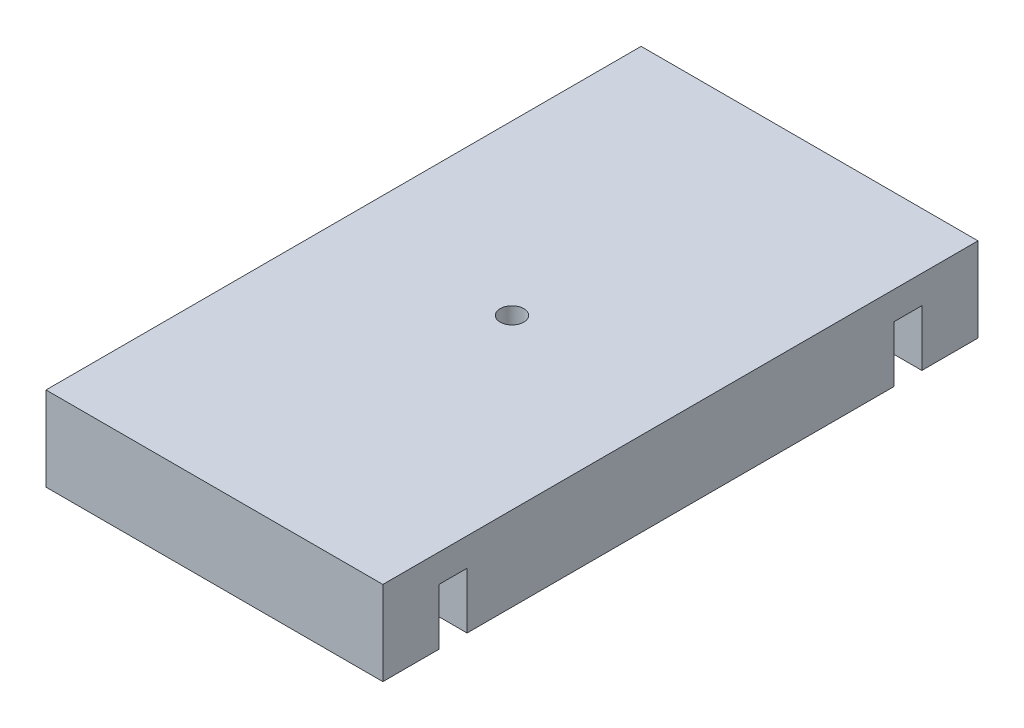
ISO-10303-21;
HEADER;
FILE_DESCRIPTION(('STEP AP214'),'2;1');
FILE_NAME('part.step','',(''),(''),'','','');
FILE_SCHEMA(('AUTOMOTIVE_DESIGN { 1 0 10303 214 1 1 1 1 }'));
ENDSEC;
DATA;
#1=APPLICATION_CONTEXT('core data for automotive mechanical design processes');
#2=APPLICATION_PROTOCOL_DEFINITION('international standard','automotive_design',2000,#1);
#3=PRODUCT_CONTEXT('',#1,'mechanical');
#4=PRODUCT('Part','Part','',(#3));
#5=PRODUCT_RELATED_PRODUCT_CATEGORY('part','',(#4));
#6=PRODUCT_DEFINITION_FORMATION('','',#4);
#7=PRODUCT_DEFINITION_CONTEXT('part definition',#1,'design');
#8=PRODUCT_DEFINITION('design','',#6,#7);
#9=PRODUCT_DEFINITION_SHAPE('','',#8);
#10=(LENGTH_UNIT() NAMED_UNIT(*) SI_UNIT(.MILLI.,.METRE.));
#11=(NAMED_UNIT(*) PLANE_ANGLE_UNIT() SI_UNIT($,.RADIAN.));
#12=(NAMED_UNIT(*) SI_UNIT($,.STERADIAN.) SOLID_ANGLE_UNIT());
#13=UNCERTAINTY_MEASURE_WITH_UNIT(LENGTH_MEASURE(1.E-05),#10,'distance_accuracy_value','');
#14=(GEOMETRIC_REPRESENTATION_CONTEXT(3) GLOBAL_UNCERTAINTY_ASSIGNED_CONTEXT((#13)) GLOBAL_UNIT_ASSIGNED_CONTEXT((#10,
#11,#12)) REPRESENTATION_CONTEXT('',''));
#15=CARTESIAN_POINT('',(0.,0.,0.));
#16=DIRECTION('',(0.,0.,1.));
#17=DIRECTION('',(1.,0.,0.));
#18=AXIS2_PLACEMENT_3D('',#15,#16,#17);
#19=CARTESIAN_POINT('',(0.,0.,0.));
#20=DIRECTION('',(0.,1.,0.));
#21=DIRECTION('',(0.,0.,1.));
#22=AXIS2_PLACEMENT_3D('',#19,#20,#21);
#23=PLANE('',#22);
#24=DIRECTION('',(0.,0.,1.));
#25=VECTOR('',#24,1.);
#26=CARTESIAN_POINT('',(-30.,0.,-53.));
#27=LINE('',#26,#25);
#28=CARTESIAN_POINT('',(-30.,0.,43.));
#29=VERTEX_POINT('',#28);
#30=CARTESIAN_POINT('',(-30.,0.,53.));
#31=VERTEX_POINT('',#30);
#32=EDGE_CURVE('E149',#29,#31,#27,.T.);
#33=ORIENTED_EDGE('',*,*,#32,.F.);
#34=DIRECTION('',(1.,0.,0.));
#35=VECTOR('',#34,1.);
#36=CARTESIAN_POINT('',(0.,0.,43.));
#37=LINE('',#36,#35);
#38=CARTESIAN_POINT('',(30.,0.,43.));
#39=VERTEX_POINT('',#38);
#40=EDGE_CURVE('E174',#29,#39,#37,.T.);
#41=ORIENTED_EDGE('',*,*,#40,.T.);
#42=DIRECTION('',(0.,0.,-1.));
#43=VECTOR('',#42,1.);
#44=CARTESIAN_POINT('',(30.,0.,-53.));
#45=LINE('',#44,#43);
#46=CARTESIAN_POINT('',(30.,0.,53.));
#47=VERTEX_POINT('',#46);
#48=EDGE_CURVE('E217',#47,#39,#45,.T.);
#49=ORIENTED_EDGE('',*,*,#48,.F.);
#50=DIRECTION('',(1.,0.,0.));
#51=VECTOR('',#50,1.);
#52=CARTESIAN_POINT('',(-30.,0.,53.));
#53=LINE('',#52,#51);
#54=EDGE_CURVE('E152',#31,#47,#53,.T.);
#55=ORIENTED_EDGE('',*,*,#54,.F.);
#56=EDGE_LOOP('',(#33,#41,#49,#55));
#57=FACE_BOUND('',#56,.T.);
#58=ADVANCED_FACE('F38',(#57),#23,.F.);
#59=CARTESIAN_POINT('',(30.,0.,-43.));
#60=VERTEX_POINT('',#59);
#61=CARTESIAN_POINT('',(30.,0.,-53.));
#62=VERTEX_POINT('',#61);
#63=EDGE_CURVE('E210',#60,#62,#45,.T.);
#64=ORIENTED_EDGE('',*,*,#63,.F.);
#65=DIRECTION('',(-1.,0.,0.));
#66=VECTOR('',#65,1.);
#67=CARTESIAN_POINT('',(0.,0.,-43.));
#68=LINE('',#67,#66);
#69=CARTESIAN_POINT('',(-30.,0.,-43.));
#70=VERTEX_POINT('',#69);
#71=EDGE_CURVE('E135',#60,#70,#68,.T.);
#72=ORIENTED_EDGE('',*,*,#71,.T.);
#73=CARTESIAN_POINT('',(-30.,0.,-53.));
#74=VERTEX_POINT('',#73);
#75=EDGE_CURVE('E148',#74,#70,#27,.T.);
#76=ORIENTED_EDGE('',*,*,#75,.F.);
#77=DIRECTION('',(-1.,0.,0.));
#78=VECTOR('',#77,1.);
#79=CARTESIAN_POINT('',(-30.,0.,-53.));
#80=LINE('',#79,#78);
#81=EDGE_CURVE('E153',#62,#74,#80,.T.);
#82=ORIENTED_EDGE('',*,*,#81,.F.);
#83=EDGE_LOOP('',(#64,#72,#76,#82));
#84=FACE_BOUND('',#83,.T.);
#85=ADVANCED_FACE('F227',(#84),#23,.F.);
#86=CARTESIAN_POINT('',(30.,15.,-53.));
#87=DIRECTION('',(-1.,0.,0.));
#88=DIRECTION('',(0.,0.,1.));
#89=AXIS2_PLACEMENT_3D('',#86,#87,#88);
#90=PLANE('',#89);
#91=ORIENTED_EDGE('',*,*,#48,.T.);
#92=DIRECTION('',(0.,1.,0.));
#93=VECTOR('',#92,1.);
#94=CARTESIAN_POINT('',(30.,15.,43.));
#95=LINE('',#94,#93);
#96=CARTESIAN_POINT('',(30.,10.,43.));
#97=VERTEX_POINT('',#96);
#98=EDGE_CURVE('E202',#39,#97,#95,.T.);
#99=ORIENTED_EDGE('',*,*,#98,.T.);
#100=DIRECTION('',(0.,0.,-1.));
#101=VECTOR('',#100,1.);
#102=CARTESIAN_POINT('',(30.,10.,-53.));
#103=LINE('',#102,#101);
#104=CARTESIAN_POINT('',(30.,10.,38.));
#105=VERTEX_POINT('',#104);
#106=EDGE_CURVE('E207',#97,#105,#103,.T.);
#107=ORIENTED_EDGE('',*,*,#106,.T.);
#108=DIRECTION('',(0.,-1.,0.));
#109=VECTOR('',#108,1.);
#110=CARTESIAN_POINT('',(30.,15.,38.));
#111=LINE('',#110,#109);
#112=CARTESIAN_POINT('',(30.,0.,38.));
#113=VERTEX_POINT('',#112);
#114=EDGE_CURVE('E196',#105,#113,#111,.T.);
#115=ORIENTED_EDGE('',*,*,#114,.T.);
#116=CARTESIAN_POINT('',(30.,0.,-38.));
#117=VERTEX_POINT('',#116);
#118=EDGE_CURVE('E219',#113,#117,#45,.T.);
#119=ORIENTED_EDGE('',*,*,#118,.T.);
#120=DIRECTION('',(0.,1.,0.));
#121=VECTOR('',#120,1.);
#122=CARTESIAN_POINT('',(30.,15.,-38.));
#123=LINE('',#122,#121);
#124=CARTESIAN_POINT('',(30.,10.,-38.));
#125=VERTEX_POINT('',#124);
#126=EDGE_CURVE('E61',#117,#125,#123,.T.);
#127=ORIENTED_EDGE('',*,*,#126,.T.);
#128=DIRECTION('',(0.,0.,1.));
#129=VECTOR('',#128,1.);
#130=CARTESIAN_POINT('',(30.,10.,-53.));
#131=LINE('',#130,#129);
#132=CARTESIAN_POINT('',(30.,10.,-43.));
#133=VERTEX_POINT('',#132);
#134=EDGE_CURVE('E205',#133,#125,#131,.T.);
#135=ORIENTED_EDGE('',*,*,#134,.F.);
#136=DIRECTION('',(0.,-1.,0.));
#137=VECTOR('',#136,1.);
#138=CARTESIAN_POINT('',(30.,15.,-43.));
#139=LINE('',#138,#137);
#140=EDGE_CURVE('E187',#133,#60,#139,.T.);
#141=ORIENTED_EDGE('',*,*,#140,.T.);
#142=ORIENTED_EDGE('',*,*,#63,.T.);
#143=DIRECTION('',(0.,-1.,0.));
#144=VECTOR('',#143,1.);
#145=CARTESIAN_POINT('',(30.,15.,-53.));
#146=LINE('',#145,#144);
#147=CARTESIAN_POINT('',(30.,15.,-53.));
#148=VERTEX_POINT('',#147);
#149=EDGE_CURVE('E136',#148,#62,#146,.T.);
#150=ORIENTED_EDGE('',*,*,#149,.F.);
#151=DIRECTION('',(0.,0.,-1.));
#152=VECTOR('',#151,1.);
#153=CARTESIAN_POINT('',(30.,15.,-53.));
#154=LINE('',#153,#152);
#155=CARTESIAN_POINT('',(30.,15.,53.));
#156=VERTEX_POINT('',#155);
#157=EDGE_CURVE('E158',#156,#148,#154,.T.);
#158=ORIENTED_EDGE('',*,*,#157,.F.);
#159=DIRECTION('',(0.,-1.,0.));
#160=VECTOR('',#159,1.);
#161=CARTESIAN_POINT('',(30.,15.,53.));
#162=LINE('',#161,#160);
#163=EDGE_CURVE('E159',#156,#47,#162,.T.);
#164=ORIENTED_EDGE('',*,*,#163,.T.);
#165=EDGE_LOOP('',(#91,#99,#107,#115,#119,#127,#135,#141,#142,#150,#158,#164));
#166=FACE_BOUND('',#165,.T.);
#167=ADVANCED_FACE('F40',(#166),#90,.F.);
#168=CARTESIAN_POINT('',(-30.,15.,-53.));
#169=DIRECTION('',(0.,0.,1.));
#170=DIRECTION('',(1.,0.,0.));
#171=AXIS2_PLACEMENT_3D('',#168,#169,#170);
#172=PLANE('',#171);
#173=ORIENTED_EDGE('',*,*,#81,.T.);
#174=DIRECTION('',(0.,-1.,0.));
#175=VECTOR('',#174,1.);
#176=CARTESIAN_POINT('',(-30.,15.,-53.));
#177=LINE('',#176,#175);
#178=CARTESIAN_POINT('',(-30.,15.,-53.));
#179=VERTEX_POINT('',#178);
#180=EDGE_CURVE('E166',#179,#74,#177,.T.);
#181=ORIENTED_EDGE('',*,*,#180,.F.);
#182=DIRECTION('',(-1.,0.,0.));
#183=VECTOR('',#182,1.);
#184=CARTESIAN_POINT('',(-30.,15.,-53.));
#185=LINE('',#184,#183);
#186=EDGE_CURVE('E213',#148,#179,#185,.T.);
#187=ORIENTED_EDGE('',*,*,#186,.F.);
#188=ORIENTED_EDGE('',*,*,#149,.T.);
#189=EDGE_LOOP('',(#173,#181,#187,#188));
#190=FACE_BOUND('',#189,.T.);
#191=ADVANCED_FACE('F230',(#190),#172,.F.);
#192=CARTESIAN_POINT('',(-30.,15.,-53.));
#193=DIRECTION('',(1.,0.,0.));
#194=DIRECTION('',(0.,0.,-1.));
#195=AXIS2_PLACEMENT_3D('',#192,#193,#194);
#196=PLANE('',#195);
#197=DIRECTION('',(0.,0.,1.));
#198=VECTOR('',#197,1.);
#199=CARTESIAN_POINT('',(-30.,10.,-53.));
#200=LINE('',#199,#198);
#201=CARTESIAN_POINT('',(-30.,10.,38.));
#202=VERTEX_POINT('',#201);
#203=CARTESIAN_POINT('',(-30.,10.,43.));
#204=VERTEX_POINT('',#203);
#205=EDGE_CURVE('E11',#202,#204,#200,.T.);
#206=ORIENTED_EDGE('',*,*,#205,.T.);
#207=DIRECTION('',(0.,-1.,0.));
#208=VECTOR('',#207,1.);
#209=CARTESIAN_POINT('',(-30.,15.,43.));
#210=LINE('',#209,#208);
#211=EDGE_CURVE('E199',#204,#29,#210,.T.);
#212=ORIENTED_EDGE('',*,*,#211,.T.);
#213=ORIENTED_EDGE('',*,*,#32,.T.);
#214=DIRECTION('',(0.,-1.,0.));
#215=VECTOR('',#214,1.);
#216=CARTESIAN_POINT('',(-30.,15.,53.));
#217=LINE('',#216,#215);
#218=CARTESIAN_POINT('',(-30.,15.,53.));
#219=VERTEX_POINT('',#218);
#220=EDGE_CURVE('E162',#219,#31,#217,.T.);
#221=ORIENTED_EDGE('',*,*,#220,.F.);
#222=DIRECTION('',(0.,0.,1.));
#223=VECTOR('',#222,1.);
#224=CARTESIAN_POINT('',(-30.,15.,-53.));
#225=LINE('',#224,#223);
#226=EDGE_CURVE('E215',#179,#219,#225,.T.);
#227=ORIENTED_EDGE('',*,*,#226,.F.);
#228=ORIENTED_EDGE('',*,*,#180,.T.);
#229=ORIENTED_EDGE('',*,*,#75,.T.);
#230=DIRECTION('',(0.,1.,0.));
#231=VECTOR('',#230,1.);
#232=CARTESIAN_POINT('',(-30.,15.,-43.));
#233=LINE('',#232,#231);
#234=CARTESIAN_POINT('',(-30.,10.,-43.));
#235=VERTEX_POINT('',#234);
#236=EDGE_CURVE('E185',#70,#235,#233,.T.);
#237=ORIENTED_EDGE('',*,*,#236,.T.);
#238=DIRECTION('',(0.,0.,-1.));
#239=VECTOR('',#238,1.);
#240=CARTESIAN_POINT('',(-30.,10.,-53.));
#241=LINE('',#240,#239);
#242=CARTESIAN_POINT('',(-30.,10.,-38.));
#243=VERTEX_POINT('',#242);
#244=EDGE_CURVE('E46',#243,#235,#241,.T.);
#245=ORIENTED_EDGE('',*,*,#244,.F.);
#246=DIRECTION('',(0.,-1.,0.));
#247=VECTOR('',#246,1.);
#248=CARTESIAN_POINT('',(-30.,15.,-38.));
#249=LINE('',#248,#247);
#250=CARTESIAN_POINT('',(-30.,0.,-38.));
#251=VERTEX_POINT('',#250);
#252=EDGE_CURVE('E129',#243,#251,#249,.T.);
#253=ORIENTED_EDGE('',*,*,#252,.T.);
#254=CARTESIAN_POINT('',(-30.,0.,38.));
#255=VERTEX_POINT('',#254);
#256=EDGE_CURVE('E142',#251,#255,#27,.T.);
#257=ORIENTED_EDGE('',*,*,#256,.T.);
#258=DIRECTION('',(0.,1.,0.));
#259=VECTOR('',#258,1.);
#260=CARTESIAN_POINT('',(-30.,15.,38.));
#261=LINE('',#260,#259);
#262=EDGE_CURVE('E53',#255,#202,#261,.T.);
#263=ORIENTED_EDGE('',*,*,#262,.T.);
#264=EDGE_LOOP('',(#206,#212,#213,#221,#227,#228,#229,#237,#245,#253,#257,#263));
#265=FACE_BOUND('',#264,.T.);
#266=ADVANCED_FACE('F141',(#265),#196,.F.);
#267=CARTESIAN_POINT('',(-30.,15.,53.));
#268=DIRECTION('',(0.,0.,-1.));
#269=DIRECTION('',(-1.,0.,0.));
#270=AXIS2_PLACEMENT_3D('',#267,#268,#269);
#271=PLANE('',#270);
#272=ORIENTED_EDGE('',*,*,#54,.T.);
#273=ORIENTED_EDGE('',*,*,#163,.F.);
#274=DIRECTION('',(1.,0.,0.));
#275=VECTOR('',#274,1.);
#276=CARTESIAN_POINT('',(-30.,15.,53.));
#277=LINE('',#276,#275);
#278=EDGE_CURVE('E163',#219,#156,#277,.T.);
#279=ORIENTED_EDGE('',*,*,#278,.F.);
#280=ORIENTED_EDGE('',*,*,#220,.T.);
#281=EDGE_LOOP('',(#272,#273,#279,#280));
#282=FACE_BOUND('',#281,.T.);
#283=ADVANCED_FACE('F283',(#282),#271,.F.);
#284=CARTESIAN_POINT('',(0.,15.,0.));
#285=DIRECTION('',(0.,1.,0.));
#286=DIRECTION('',(0.,0.,1.));
#287=AXIS2_PLACEMENT_3D('',#284,#285,#286);
#288=PLANE('',#287);
#289=CARTESIAN_POINT('',(0.,15.,0.));
#290=DIRECTION('',(0.,1.,0.));
#291=DIRECTION('',(0.,0.,1.));
#292=AXIS2_PLACEMENT_3D('',#289,#290,#291);
#293=CIRCLE('',#292,2.1);
#294=CARTESIAN_POINT('',(0.,15.,2.1));
#295=VERTEX_POINT('',#294);
#296=EDGE_CURVE('E188',#295,#295,#293,.T.);
#297=ORIENTED_EDGE('',*,*,#296,.F.);
#298=EDGE_LOOP('',(#297));
#299=FACE_BOUND('',#298,.T.);
#300=ORIENTED_EDGE('',*,*,#157,.T.);
#301=ORIENTED_EDGE('',*,*,#186,.T.);
#302=ORIENTED_EDGE('',*,*,#226,.T.);
#303=ORIENTED_EDGE('',*,*,#278,.T.);
#304=EDGE_LOOP('',(#300,#301,#302,#303));
#305=FACE_BOUND('',#304,.T.);
#306=ADVANCED_FACE('F233',(#299,#305),#288,.T.);
#307=CARTESIAN_POINT('',(0.,0.,0.));
#308=DIRECTION('',(0.,1.,0.));
#309=DIRECTION('',(0.,0.,1.));
#310=AXIS2_PLACEMENT_3D('',#307,#308,#309);
#311=CIRCLE('',#310,2.1);
#312=CARTESIAN_POINT('',(0.,0.,2.1));
#313=VERTEX_POINT('',#312);
#314=EDGE_CURVE('E256',#313,#313,#311,.T.);
#315=ORIENTED_EDGE('',*,*,#314,.T.);
#316=EDGE_LOOP('',(#315));
#317=FACE_BOUND('',#316,.T.);
#318=ORIENTED_EDGE('',*,*,#118,.F.);
#319=DIRECTION('',(-1.,0.,0.));
#320=VECTOR('',#319,1.);
#321=CARTESIAN_POINT('',(0.,0.,38.));
#322=LINE('',#321,#320);
#323=EDGE_CURVE('E147',#113,#255,#322,.T.);
#324=ORIENTED_EDGE('',*,*,#323,.T.);
#325=ORIENTED_EDGE('',*,*,#256,.F.);
#326=DIRECTION('',(1.,0.,0.));
#327=VECTOR('',#326,1.);
#328=CARTESIAN_POINT('',(0.,0.,-38.));
#329=LINE('',#328,#327);
#330=EDGE_CURVE('E126',#251,#117,#329,.T.);
#331=ORIENTED_EDGE('',*,*,#330,.T.);
#332=EDGE_LOOP('',(#318,#324,#325,#331));
#333=FACE_BOUND('',#332,.T.);
#334=ADVANCED_FACE('F146',(#317,#333),#23,.F.);
#335=CARTESIAN_POINT('',(0.,10.,0.));
#336=DIRECTION('',(0.,-1.,0.));
#337=DIRECTION('',(0.,0.,-1.));
#338=AXIS2_PLACEMENT_3D('',#335,#336,#337);
#339=PLANE('',#338);
#340=ORIENTED_EDGE('',*,*,#134,.T.);
#341=DIRECTION('',(-1.,0.,0.));
#342=VECTOR('',#341,1.);
#343=CARTESIAN_POINT('',(38.6401914277318,10.,-38.));
#344=LINE('',#343,#342);
#345=EDGE_CURVE('E182',#125,#243,#344,.T.);
#346=ORIENTED_EDGE('',*,*,#345,.T.);
#347=ORIENTED_EDGE('',*,*,#244,.T.);
#348=DIRECTION('',(1.,0.,0.));
#349=VECTOR('',#348,1.);
#350=CARTESIAN_POINT('',(-32.9578103354183,10.,-43.));
#351=LINE('',#350,#349);
#352=EDGE_CURVE('E180',#235,#133,#351,.T.);
#353=ORIENTED_EDGE('',*,*,#352,.T.);
#354=EDGE_LOOP('',(#340,#346,#347,#353));
#355=FACE_BOUND('',#354,.T.);
#356=ADVANCED_FACE('F179',(#355),#339,.T.);
#357=CARTESIAN_POINT('',(-32.9578103354183,10.,-43.));
#358=DIRECTION('',(0.,0.,-1.));
#359=DIRECTION('',(-1.,0.,0.));
#360=AXIS2_PLACEMENT_3D('',#357,#358,#359);
#361=PLANE('',#360);
#362=ORIENTED_EDGE('',*,*,#352,.F.);
#363=ORIENTED_EDGE('',*,*,#236,.F.);
#364=ORIENTED_EDGE('',*,*,#71,.F.);
#365=ORIENTED_EDGE('',*,*,#140,.F.);
#366=EDGE_LOOP('',(#362,#363,#364,#365));
#367=FACE_BOUND('',#366,.T.);
#368=ADVANCED_FACE('F184',(#367),#361,.F.);
#369=CARTESIAN_POINT('',(38.6401914277318,10.,-38.));
#370=DIRECTION('',(0.,0.,1.));
#371=DIRECTION('',(1.,0.,0.));
#372=AXIS2_PLACEMENT_3D('',#369,#370,#371);
#373=PLANE('',#372);
#374=ORIENTED_EDGE('',*,*,#330,.F.);
#375=ORIENTED_EDGE('',*,*,#252,.F.);
#376=ORIENTED_EDGE('',*,*,#345,.F.);
#377=ORIENTED_EDGE('',*,*,#126,.F.);
#378=EDGE_LOOP('',(#374,#375,#376,#377));
#379=FACE_BOUND('',#378,.T.);
#380=ADVANCED_FACE('F128',(#379),#373,.F.);
#381=CARTESIAN_POINT('',(0.,10.,0.));
#382=DIRECTION('',(0.,1.,0.));
#383=DIRECTION('',(0.,0.,1.));
#384=AXIS2_PLACEMENT_3D('',#381,#382,#383);
#385=PLANE('',#384);
#386=DIRECTION('',(-1.,0.,0.));
#387=VECTOR('',#386,1.);
#388=CARTESIAN_POINT('',(-32.9578103354183,10.,43.));
#389=LINE('',#388,#387);
#390=EDGE_CURVE('E144',#97,#204,#389,.T.);
#391=ORIENTED_EDGE('',*,*,#390,.T.);
#392=ORIENTED_EDGE('',*,*,#205,.F.);
#393=DIRECTION('',(1.,0.,0.));
#394=VECTOR('',#393,1.);
#395=CARTESIAN_POINT('',(38.6401914277318,10.,38.));
#396=LINE('',#395,#394);
#397=EDGE_CURVE('E248',#202,#105,#396,.T.);
#398=ORIENTED_EDGE('',*,*,#397,.T.);
#399=ORIENTED_EDGE('',*,*,#106,.F.);
#400=EDGE_LOOP('',(#391,#392,#398,#399));
#401=FACE_BOUND('',#400,.T.);
#402=ADVANCED_FACE('F247',(#401),#385,.F.);
#403=CARTESIAN_POINT('',(-32.9578103354183,10.,43.));
#404=DIRECTION('',(0.,0.,1.));
#405=DIRECTION('',(1.,0.,0.));
#406=AXIS2_PLACEMENT_3D('',#403,#404,#405);
#407=PLANE('',#406);
#408=ORIENTED_EDGE('',*,*,#40,.F.);
#409=ORIENTED_EDGE('',*,*,#211,.F.);
#410=ORIENTED_EDGE('',*,*,#390,.F.);
#411=ORIENTED_EDGE('',*,*,#98,.F.);
#412=EDGE_LOOP('',(#408,#409,#410,#411));
#413=FACE_BOUND('',#412,.T.);
#414=ADVANCED_FACE('F241',(#413),#407,.F.);
#415=CARTESIAN_POINT('',(38.6401914277318,10.,38.));
#416=DIRECTION('',(0.,0.,-1.));
#417=DIRECTION('',(-1.,0.,0.));
#418=AXIS2_PLACEMENT_3D('',#415,#416,#417);
#419=PLANE('',#418);
#420=ORIENTED_EDGE('',*,*,#397,.F.);
#421=ORIENTED_EDGE('',*,*,#262,.F.);
#422=ORIENTED_EDGE('',*,*,#323,.F.);
#423=ORIENTED_EDGE('',*,*,#114,.F.);
#424=EDGE_LOOP('',(#420,#421,#422,#423));
#425=FACE_BOUND('',#424,.T.);
#426=ADVANCED_FACE('F249',(#425),#419,.F.);
#427=CARTESIAN_POINT('',(0.,0.,0.));
#428=DIRECTION('',(0.,1.,0.));
#429=DIRECTION('',(0.,0.,1.));
#430=AXIS2_PLACEMENT_3D('',#427,#428,#429);
#431=CYLINDRICAL_SURFACE('',#430,2.1);
#432=ORIENTED_EDGE('',*,*,#296,.T.);
#433=EDGE_LOOP('',(#432));
#434=FACE_BOUND('',#433,.T.);
#435=ORIENTED_EDGE('',*,*,#314,.F.);
#436=EDGE_LOOP('',(#435));
#437=FACE_BOUND('',#436,.T.);
#438=ADVANCED_FACE('F261',(#434,#437),#431,.F.);
#439=CLOSED_SHELL('',(#58,#85,#167,#191,#266,#283,#306,#334,#356,#368,#380,#402,#414,#426,#438));
#440=MANIFOLD_SOLID_BREP('B2',#439);
#441=ADVANCED_BREP_SHAPE_REPRESENTATION('',(#18,#440),#14);
#442=SHAPE_DEFINITION_REPRESENTATION(#9,#441);
ENDSEC;
END-ISO-10303-21;
